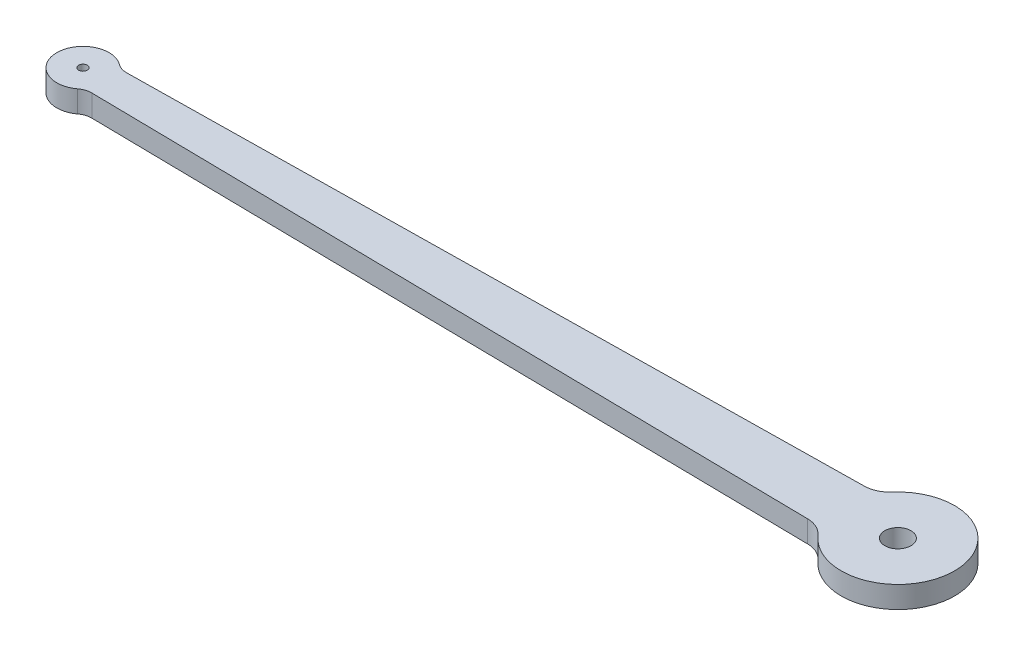
ISO-10303-21;
HEADER;
FILE_DESCRIPTION(('STEP AP214'),'2;1');
FILE_NAME('part.step','',(''),(''),'','','');
FILE_SCHEMA(('AUTOMOTIVE_DESIGN { 1 0 10303 214 1 1 1 1 }'));
ENDSEC;
DATA;
#1=APPLICATION_CONTEXT('core data for automotive mechanical design processes');
#2=APPLICATION_PROTOCOL_DEFINITION('international standard','automotive_design',2000,#1);
#3=PRODUCT_CONTEXT('',#1,'mechanical');
#4=PRODUCT('Part','Part','',(#3));
#5=PRODUCT_RELATED_PRODUCT_CATEGORY('part','',(#4));
#6=PRODUCT_DEFINITION_FORMATION('','',#4);
#7=PRODUCT_DEFINITION_CONTEXT('part definition',#1,'design');
#8=PRODUCT_DEFINITION('design','',#6,#7);
#9=PRODUCT_DEFINITION_SHAPE('','',#8);
#10=(LENGTH_UNIT() NAMED_UNIT(*) SI_UNIT(.MILLI.,.METRE.));
#11=(NAMED_UNIT(*) PLANE_ANGLE_UNIT() SI_UNIT($,.RADIAN.));
#12=(NAMED_UNIT(*) SI_UNIT($,.STERADIAN.) SOLID_ANGLE_UNIT());
#13=UNCERTAINTY_MEASURE_WITH_UNIT(LENGTH_MEASURE(1.E-05),#10,'distance_accuracy_value','');
#14=(GEOMETRIC_REPRESENTATION_CONTEXT(3) GLOBAL_UNCERTAINTY_ASSIGNED_CONTEXT((#13)) GLOBAL_UNIT_ASSIGNED_CONTEXT((#10,
#11,#12)) REPRESENTATION_CONTEXT('',''));
#15=CARTESIAN_POINT('',(0.,0.,0.));
#16=DIRECTION('',(0.,0.,1.));
#17=DIRECTION('',(1.,0.,0.));
#18=AXIS2_PLACEMENT_3D('',#15,#16,#17);
#19=CARTESIAN_POINT('',(39.5951614105319,2.5,-6.24966277159476));
#20=DIRECTION('',(0.,-1.,0.));
#21=DIRECTION('',(0.,0.,-1.));
#22=AXIS2_PLACEMENT_3D('',#19,#20,#21);
#23=CYLINDRICAL_SURFACE('',#22,3.);
#24=CARTESIAN_POINT('',(39.5951614105319,0.,-6.24966277159476));
#25=DIRECTION('',(0.,-1.,0.));
#26=DIRECTION('',(0.,0.,1.));
#27=AXIS2_PLACEMENT_3D('',#24,#25,#26);
#28=CIRCLE('',#27,3.);
#29=CARTESIAN_POINT('',(41.8545841229955,0.,-4.27608505424905));
#30=VERTEX_POINT('',#29);
#31=CARTESIAN_POINT('',(39.6401420364545,0.,-3.25));
#32=VERTEX_POINT('',#31);
#33=EDGE_CURVE('E131',#30,#32,#28,.T.);
#34=ORIENTED_EDGE('',*,*,#33,.T.);
#35=DIRECTION('',(0.,-1.,0.));
#36=VECTOR('',#35,1.);
#37=CARTESIAN_POINT('',(39.6401420364545,2.5,-3.25));
#38=LINE('',#37,#36);
#39=CARTESIAN_POINT('',(39.6401420364545,2.5,-3.25));
#40=VERTEX_POINT('',#39);
#41=EDGE_CURVE('E11',#40,#32,#38,.T.);
#42=ORIENTED_EDGE('',*,*,#41,.F.);
#43=CARTESIAN_POINT('',(39.5951614105319,2.5,-6.24966277159476));
#44=DIRECTION('',(0.,-1.,0.));
#45=DIRECTION('',(0.,0.,1.));
#46=AXIS2_PLACEMENT_3D('',#43,#44,#45);
#47=CIRCLE('',#46,3.);
#48=CARTESIAN_POINT('',(41.8545841229955,2.5,-4.27608505424905));
#49=VERTEX_POINT('',#48);
#50=EDGE_CURVE('E146',#49,#40,#47,.T.);
#51=ORIENTED_EDGE('',*,*,#50,.F.);
#52=DIRECTION('',(0.,-1.,0.));
#53=VECTOR('',#52,1.);
#54=CARTESIAN_POINT('',(41.8545841229955,2.5,-4.27608505424905));
#55=LINE('',#54,#53);
#56=EDGE_CURVE('E127',#49,#30,#55,.T.);
#57=ORIENTED_EDGE('',*,*,#56,.T.);
#58=EDGE_LOOP('',(#34,#42,#51,#57));
#59=FACE_BOUND('',#58,.T.);
#60=ADVANCED_FACE('F35',(#59),#23,.F.);
#61=CARTESIAN_POINT('',(39.6401420364545,2.5,-3.25));
#62=DIRECTION('',(0.0149935419742022,0.,0.99988759053159));
#63=DIRECTION('',(0.99988759053159,0.,-0.0149935419742022));
#64=AXIS2_PLACEMENT_3D('',#61,#62,#63);
#65=PLANE('',#64);
#66=DIRECTION('',(-0.99988759053159,0.,0.0149935419742022));
#67=VECTOR('',#66,1.);
#68=CARTESIAN_POINT('',(39.6401420364545,0.,-3.25));
#69=LINE('',#68,#67);
#70=CARTESIAN_POINT('',(-43.7197131808668,0.,-2.00000000000016));
#71=VERTEX_POINT('',#70);
#72=EDGE_CURVE('E134',#32,#71,#69,.T.);
#73=ORIENTED_EDGE('',*,*,#72,.T.);
#74=DIRECTION('',(0.,-1.,0.));
#75=VECTOR('',#74,1.);
#76=CARTESIAN_POINT('',(-43.7197131808668,2.5,-2.00000000000016));
#77=LINE('',#76,#75);
#78=CARTESIAN_POINT('',(-43.7197131808668,2.5,-2.00000000000016));
#79=VERTEX_POINT('',#78);
#80=EDGE_CURVE('E43',#79,#71,#77,.T.);
#81=ORIENTED_EDGE('',*,*,#80,.F.);
#82=DIRECTION('',(-0.99988759053159,0.,0.0149935419742022));
#83=VECTOR('',#82,1.);
#84=CARTESIAN_POINT('',(39.6401420364545,2.5,-3.25));
#85=LINE('',#84,#83);
#86=EDGE_CURVE('E94',#40,#79,#85,.T.);
#87=ORIENTED_EDGE('',*,*,#86,.F.);
#88=ORIENTED_EDGE('',*,*,#41,.T.);
#89=EDGE_LOOP('',(#73,#81,#87,#88));
#90=FACE_BOUND('',#89,.T.);
#91=ADVANCED_FACE('F214',(#90),#65,.F.);
#92=CARTESIAN_POINT('',(-43.7497002648152,2.5,-3.99977518106334));
#93=DIRECTION('',(0.,-1.,0.));
#94=DIRECTION('',(0.,0.,-1.));
#95=AXIS2_PLACEMENT_3D('',#92,#93,#94);
#96=CYLINDRICAL_SURFACE('',#95,2.);
#97=CARTESIAN_POINT('',(-43.7497002648152,0.,-3.99977518106334));
#98=DIRECTION('',(0.,-1.,0.));
#99=DIRECTION('',(0.,0.,-1.));
#100=AXIS2_PLACEMENT_3D('',#97,#98,#99);
#101=CIRCLE('',#100,2.);
#102=CARTESIAN_POINT('',(-44.9498201588891,0.,-2.399865108638));
#103=VERTEX_POINT('',#102);
#104=EDGE_CURVE('E137',#71,#103,#101,.T.);
#105=ORIENTED_EDGE('',*,*,#104,.T.);
#106=DIRECTION('',(0.,-1.,0.));
#107=VECTOR('',#106,1.);
#108=CARTESIAN_POINT('',(-44.9498201588891,2.5,-2.399865108638));
#109=LINE('',#108,#107);
#110=CARTESIAN_POINT('',(-44.9498201588891,2.5,-2.399865108638));
#111=VERTEX_POINT('',#110);
#112=EDGE_CURVE('E153',#111,#103,#109,.T.);
#113=ORIENTED_EDGE('',*,*,#112,.F.);
#114=CARTESIAN_POINT('',(-43.7497002648152,2.5,-3.99977518106334));
#115=DIRECTION('',(0.,-1.,0.));
#116=DIRECTION('',(0.,0.,-1.));
#117=AXIS2_PLACEMENT_3D('',#114,#115,#116);
#118=CIRCLE('',#117,2.);
#119=EDGE_CURVE('E161',#79,#111,#118,.T.);
#120=ORIENTED_EDGE('',*,*,#119,.F.);
#121=ORIENTED_EDGE('',*,*,#80,.T.);
#122=EDGE_LOOP('',(#105,#113,#120,#121));
#123=FACE_BOUND('',#122,.T.);
#124=ADVANCED_FACE('F159',(#123),#96,.F.);
#125=CARTESIAN_POINT('',(-46.75,2.5,0.));
#126=DIRECTION('',(0.,-1.,0.));
#127=DIRECTION('',(0.,0.,-1.));
#128=AXIS2_PLACEMENT_3D('',#125,#126,#127);
#129=CYLINDRICAL_SURFACE('',#128,3.);
#130=CARTESIAN_POINT('',(-46.75,0.,0.));
#131=DIRECTION('',(0.,1.,0.));
#132=DIRECTION('',(0.,0.,1.));
#133=AXIS2_PLACEMENT_3D('',#130,#131,#132);
#134=CIRCLE('',#133,3.);
#135=CARTESIAN_POINT('',(-44.9498201588891,0.,2.39986510863801));
#136=VERTEX_POINT('',#135);
#137=EDGE_CURVE('E139',#103,#136,#134,.T.);
#138=ORIENTED_EDGE('',*,*,#137,.T.);
#139=DIRECTION('',(0.,-1.,0.));
#140=VECTOR('',#139,1.);
#141=CARTESIAN_POINT('',(-44.9498201588891,2.5,2.39986510863801));
#142=LINE('',#141,#140);
#143=CARTESIAN_POINT('',(-44.9498201588891,2.5,2.39986510863801));
#144=VERTEX_POINT('',#143);
#145=EDGE_CURVE('E150',#144,#136,#142,.T.);
#146=ORIENTED_EDGE('',*,*,#145,.F.);
#147=CARTESIAN_POINT('',(-46.75,2.5,0.));
#148=DIRECTION('',(0.,1.,0.));
#149=DIRECTION('',(0.,0.,1.));
#150=AXIS2_PLACEMENT_3D('',#147,#148,#149);
#151=CIRCLE('',#150,3.);
#152=EDGE_CURVE('E173',#111,#144,#151,.T.);
#153=ORIENTED_EDGE('',*,*,#152,.F.);
#154=ORIENTED_EDGE('',*,*,#112,.T.);
#155=EDGE_LOOP('',(#138,#146,#153,#154));
#156=FACE_BOUND('',#155,.T.);
#157=ADVANCED_FACE('F169',(#156),#129,.T.);
#158=CARTESIAN_POINT('',(-43.7497002648152,2.5,3.99977518106334));
#159=DIRECTION('',(0.,-1.,0.));
#160=DIRECTION('',(0.,0.,-1.));
#161=AXIS2_PLACEMENT_3D('',#158,#159,#160);
#162=CYLINDRICAL_SURFACE('',#161,2.);
#163=CARTESIAN_POINT('',(-43.7497002648152,0.,3.99977518106334));
#164=DIRECTION('',(0.,-1.,0.));
#165=DIRECTION('',(0.,0.,1.));
#166=AXIS2_PLACEMENT_3D('',#163,#164,#165);
#167=CIRCLE('',#166,2.);
#168=CARTESIAN_POINT('',(-43.7197131808668,0.,2.00000000000016));
#169=VERTEX_POINT('',#168);
#170=EDGE_CURVE('E141',#136,#169,#167,.T.);
#171=ORIENTED_EDGE('',*,*,#170,.T.);
#172=DIRECTION('',(0.,-1.,0.));
#173=VECTOR('',#172,1.);
#174=CARTESIAN_POINT('',(-43.7197131808668,2.5,2.00000000000016));
#175=LINE('',#174,#173);
#176=CARTESIAN_POINT('',(-43.7197131808668,2.5,2.00000000000016));
#177=VERTEX_POINT('',#176);
#178=EDGE_CURVE('E122',#177,#169,#175,.T.);
#179=ORIENTED_EDGE('',*,*,#178,.F.);
#180=CARTESIAN_POINT('',(-43.7497002648152,2.5,3.99977518106334));
#181=DIRECTION('',(0.,-1.,0.));
#182=DIRECTION('',(0.,0.,1.));
#183=AXIS2_PLACEMENT_3D('',#180,#181,#182);
#184=CIRCLE('',#183,2.);
#185=EDGE_CURVE('E113',#144,#177,#184,.T.);
#186=ORIENTED_EDGE('',*,*,#185,.F.);
#187=ORIENTED_EDGE('',*,*,#145,.T.);
#188=EDGE_LOOP('',(#171,#179,#186,#187));
#189=FACE_BOUND('',#188,.T.);
#190=ADVANCED_FACE('F172',(#189),#162,.F.);
#191=CARTESIAN_POINT('',(39.6401420364545,2.5,3.24999999999999));
#192=DIRECTION('',(0.0149935419742021,0.,-0.99988759053159));
#193=DIRECTION('',(-0.99988759053159,0.,-0.0149935419742021));
#194=AXIS2_PLACEMENT_3D('',#191,#192,#193);
#195=PLANE('',#194);
#196=DIRECTION('',(0.99988759053159,0.,0.0149935419742021));
#197=VECTOR('',#196,1.);
#198=CARTESIAN_POINT('',(39.6401420364545,0.,3.24999999999999));
#199=LINE('',#198,#197);
#200=CARTESIAN_POINT('',(39.6401420364545,0.,3.24999999999999));
#201=VERTEX_POINT('',#200);
#202=EDGE_CURVE('E121',#169,#201,#199,.T.);
#203=ORIENTED_EDGE('',*,*,#202,.T.);
#204=DIRECTION('',(0.,-1.,0.));
#205=VECTOR('',#204,1.);
#206=CARTESIAN_POINT('',(39.6401420364545,2.5,3.24999999999999));
#207=LINE('',#206,#205);
#208=CARTESIAN_POINT('',(39.6401420364545,2.5,3.24999999999999));
#209=VERTEX_POINT('',#208);
#210=EDGE_CURVE('E118',#209,#201,#207,.T.);
#211=ORIENTED_EDGE('',*,*,#210,.F.);
#212=DIRECTION('',(0.99988759053159,0.,0.0149935419742021));
#213=VECTOR('',#212,1.);
#214=CARTESIAN_POINT('',(39.6401420364545,2.5,3.24999999999999));
#215=LINE('',#214,#213);
#216=EDGE_CURVE('E107',#177,#209,#215,.T.);
#217=ORIENTED_EDGE('',*,*,#216,.F.);
#218=ORIENTED_EDGE('',*,*,#178,.T.);
#219=EDGE_LOOP('',(#203,#211,#217,#218));
#220=FACE_BOUND('',#219,.T.);
#221=ADVANCED_FACE('F119',(#220),#195,.F.);
#222=CARTESIAN_POINT('',(39.5951614105319,2.5,6.24966277159476));
#223=DIRECTION('',(0.,-1.,0.));
#224=DIRECTION('',(0.,0.,-1.));
#225=AXIS2_PLACEMENT_3D('',#222,#223,#224);
#226=CYLINDRICAL_SURFACE('',#225,3.);
#227=CARTESIAN_POINT('',(39.5951614105319,0.,6.24966277159476));
#228=DIRECTION('',(0.,-1.,0.));
#229=DIRECTION('',(0.,0.,-1.));
#230=AXIS2_PLACEMENT_3D('',#227,#228,#229);
#231=CIRCLE('',#230,3.);
#232=CARTESIAN_POINT('',(41.8545841229955,0.,4.27608505424905));
#233=VERTEX_POINT('',#232);
#234=EDGE_CURVE('E80',#201,#233,#231,.T.);
#235=ORIENTED_EDGE('',*,*,#234,.T.);
#236=DIRECTION('',(0.,-1.,0.));
#237=VECTOR('',#236,1.);
#238=CARTESIAN_POINT('',(41.8545841229955,2.5,4.27608505424905));
#239=LINE('',#238,#237);
#240=CARTESIAN_POINT('',(41.8545841229955,2.5,4.27608505424905));
#241=VERTEX_POINT('',#240);
#242=EDGE_CURVE('E123',#241,#233,#239,.T.);
#243=ORIENTED_EDGE('',*,*,#242,.F.);
#244=CARTESIAN_POINT('',(39.5951614105319,2.5,6.24966277159476));
#245=DIRECTION('',(0.,-1.,0.));
#246=DIRECTION('',(0.,0.,-1.));
#247=AXIS2_PLACEMENT_3D('',#244,#245,#246);
#248=CIRCLE('',#247,3.);
#249=EDGE_CURVE('E111',#209,#241,#248,.T.);
#250=ORIENTED_EDGE('',*,*,#249,.F.);
#251=ORIENTED_EDGE('',*,*,#210,.T.);
#252=EDGE_LOOP('',(#235,#243,#250,#251));
#253=FACE_BOUND('',#252,.T.);
#254=ADVANCED_FACE('F125',(#253),#226,.F.);
#255=CARTESIAN_POINT('',(46.75,2.5,0.));
#256=DIRECTION('',(0.,-1.,0.));
#257=DIRECTION('',(0.,0.,-1.));
#258=AXIS2_PLACEMENT_3D('',#255,#256,#257);
#259=CYLINDRICAL_SURFACE('',#258,6.5);
#260=CARTESIAN_POINT('',(46.75,0.,0.));
#261=DIRECTION('',(0.,1.,0.));
#262=DIRECTION('',(0.,0.,1.));
#263=AXIS2_PLACEMENT_3D('',#260,#261,#262);
#264=CIRCLE('',#263,6.5);
#265=EDGE_CURVE('E86',#233,#30,#264,.T.);
#266=ORIENTED_EDGE('',*,*,#265,.T.);
#267=ORIENTED_EDGE('',*,*,#56,.F.);
#268=CARTESIAN_POINT('',(46.75,2.5,0.));
#269=DIRECTION('',(0.,1.,0.));
#270=DIRECTION('',(0.,0.,1.));
#271=AXIS2_PLACEMENT_3D('',#268,#269,#270);
#272=CIRCLE('',#271,6.5);
#273=EDGE_CURVE('E51',#241,#49,#272,.T.);
#274=ORIENTED_EDGE('',*,*,#273,.F.);
#275=ORIENTED_EDGE('',*,*,#242,.T.);
#276=EDGE_LOOP('',(#266,#267,#274,#275));
#277=FACE_BOUND('',#276,.T.);
#278=ADVANCED_FACE('F196',(#277),#259,.T.);
#279=CARTESIAN_POINT('',(39.5951614105319,2.5,-6.24966277159476));
#280=DIRECTION('',(0.,1.,0.));
#281=DIRECTION('',(0.,0.,1.));
#282=AXIS2_PLACEMENT_3D('',#279,#280,#281);
#283=PLANE('',#282);
#284=CARTESIAN_POINT('',(46.75,2.5,0.));
#285=DIRECTION('',(0.,1.,0.));
#286=DIRECTION('',(0.,0.,1.));
#287=AXIS2_PLACEMENT_3D('',#284,#285,#286);
#288=CIRCLE('',#287,1.5);
#289=CARTESIAN_POINT('',(46.75,2.5,1.5));
#290=VERTEX_POINT('',#289);
#291=EDGE_CURVE('E187',#290,#290,#288,.T.);
#292=ORIENTED_EDGE('',*,*,#291,.F.);
#293=EDGE_LOOP('',(#292));
#294=FACE_BOUND('',#293,.T.);
#295=CARTESIAN_POINT('',(-46.75,2.5,0.));
#296=DIRECTION('',(0.,1.,0.));
#297=DIRECTION('',(0.,0.,1.));
#298=AXIS2_PLACEMENT_3D('',#295,#296,#297);
#299=CIRCLE('',#298,0.499999999999999);
#300=CARTESIAN_POINT('',(-46.75,2.5,0.499999999999999));
#301=VERTEX_POINT('',#300);
#302=EDGE_CURVE('E181',#301,#301,#299,.T.);
#303=ORIENTED_EDGE('',*,*,#302,.F.);
#304=EDGE_LOOP('',(#303));
#305=FACE_BOUND('',#304,.T.);
#306=ORIENTED_EDGE('',*,*,#50,.T.);
#307=ORIENTED_EDGE('',*,*,#86,.T.);
#308=ORIENTED_EDGE('',*,*,#119,.T.);
#309=ORIENTED_EDGE('',*,*,#152,.T.);
#310=ORIENTED_EDGE('',*,*,#185,.T.);
#311=ORIENTED_EDGE('',*,*,#216,.T.);
#312=ORIENTED_EDGE('',*,*,#249,.T.);
#313=ORIENTED_EDGE('',*,*,#273,.T.);
#314=EDGE_LOOP('',(#306,#307,#308,#309,#310,#311,#312,#313));
#315=FACE_BOUND('',#314,.T.);
#316=ADVANCED_FACE('F109',(#294,#305,#315),#283,.T.);
#317=CARTESIAN_POINT('',(39.5951614105319,0.,-6.24966277159476));
#318=DIRECTION('',(0.,1.,0.));
#319=DIRECTION('',(0.,0.,1.));
#320=AXIS2_PLACEMENT_3D('',#317,#318,#319);
#321=PLANE('',#320);
#322=CARTESIAN_POINT('',(46.75,0.,0.));
#323=DIRECTION('',(0.,1.,0.));
#324=DIRECTION('',(0.,0.,1.));
#325=AXIS2_PLACEMENT_3D('',#322,#323,#324);
#326=CIRCLE('',#325,1.5);
#327=CARTESIAN_POINT('',(46.75,0.,1.5));
#328=VERTEX_POINT('',#327);
#329=EDGE_CURVE('E184',#328,#328,#326,.F.);
#330=ORIENTED_EDGE('',*,*,#329,.F.);
#331=EDGE_LOOP('',(#330));
#332=FACE_BOUND('',#331,.T.);
#333=CARTESIAN_POINT('',(-46.75,0.,0.));
#334=DIRECTION('',(0.,1.,0.));
#335=DIRECTION('',(0.,0.,1.));
#336=AXIS2_PLACEMENT_3D('',#333,#334,#335);
#337=CIRCLE('',#336,0.499999999999999);
#338=CARTESIAN_POINT('',(-46.75,0.,0.499999999999999));
#339=VERTEX_POINT('',#338);
#340=EDGE_CURVE('E135',#339,#339,#337,.F.);
#341=ORIENTED_EDGE('',*,*,#340,.F.);
#342=EDGE_LOOP('',(#341));
#343=FACE_BOUND('',#342,.T.);
#344=ORIENTED_EDGE('',*,*,#33,.F.);
#345=ORIENTED_EDGE('',*,*,#265,.F.);
#346=ORIENTED_EDGE('',*,*,#234,.F.);
#347=ORIENTED_EDGE('',*,*,#202,.F.);
#348=ORIENTED_EDGE('',*,*,#170,.F.);
#349=ORIENTED_EDGE('',*,*,#137,.F.);
#350=ORIENTED_EDGE('',*,*,#104,.F.);
#351=ORIENTED_EDGE('',*,*,#72,.F.);
#352=EDGE_LOOP('',(#344,#345,#346,#347,#348,#349,#350,#351));
#353=FACE_BOUND('',#352,.T.);
#354=ADVANCED_FACE('F165',(#332,#343,#353),#321,.F.);
#355=CARTESIAN_POINT('',(-46.75,-0.00100000000000013,0.));
#356=DIRECTION('',(0.,1.,0.));
#357=DIRECTION('',(0.,0.,1.));
#358=AXIS2_PLACEMENT_3D('',#355,#356,#357);
#359=CYLINDRICAL_SURFACE('',#358,0.499999999999999);
#360=ORIENTED_EDGE('',*,*,#302,.T.);
#361=EDGE_LOOP('',(#360));
#362=FACE_BOUND('',#361,.T.);
#363=ORIENTED_EDGE('',*,*,#340,.T.);
#364=EDGE_LOOP('',(#363));
#365=FACE_BOUND('',#364,.T.);
#366=ADVANCED_FACE('F200',(#362,#365),#359,.F.);
#367=CARTESIAN_POINT('',(46.75,-0.00100000000000013,0.));
#368=DIRECTION('',(0.,1.,0.));
#369=DIRECTION('',(0.,0.,1.));
#370=AXIS2_PLACEMENT_3D('',#367,#368,#369);
#371=CYLINDRICAL_SURFACE('',#370,1.5);
#372=ORIENTED_EDGE('',*,*,#291,.T.);
#373=EDGE_LOOP('',(#372));
#374=FACE_BOUND('',#373,.T.);
#375=ORIENTED_EDGE('',*,*,#329,.T.);
#376=EDGE_LOOP('',(#375));
#377=FACE_BOUND('',#376,.T.);
#378=ADVANCED_FACE('F191',(#374,#377),#371,.F.);
#379=CLOSED_SHELL('',(#60,#91,#124,#157,#190,#221,#254,#278,#316,#354,#366,#378));
#380=MANIFOLD_SOLID_BREP('B2',#379);
#381=ADVANCED_BREP_SHAPE_REPRESENTATION('',(#18,#380),#14);
#382=SHAPE_DEFINITION_REPRESENTATION(#9,#381);
ENDSEC;
END-ISO-10303-21;
